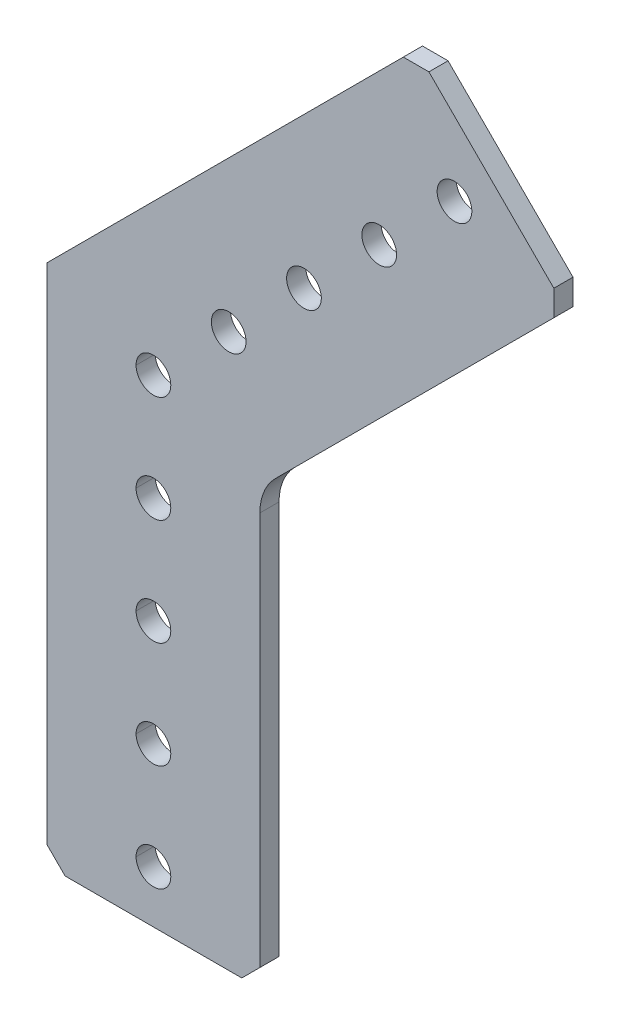
ISO-10303-21;
HEADER;
FILE_DESCRIPTION(('STEP AP214'),'2;1');
FILE_NAME('part.step','',(''),(''),'','','');
FILE_SCHEMA(('AUTOMOTIVE_DESIGN { 1 0 10303 214 1 1 1 1 }'));
ENDSEC;
DATA;
#1=APPLICATION_CONTEXT('core data for automotive mechanical design processes');
#2=APPLICATION_PROTOCOL_DEFINITION('international standard','automotive_design',2000,#1);
#3=PRODUCT_CONTEXT('',#1,'mechanical');
#4=PRODUCT('Part','Part','',(#3));
#5=PRODUCT_RELATED_PRODUCT_CATEGORY('part','',(#4));
#6=PRODUCT_DEFINITION_FORMATION('','',#4);
#7=PRODUCT_DEFINITION_CONTEXT('part definition',#1,'design');
#8=PRODUCT_DEFINITION('design','',#6,#7);
#9=PRODUCT_DEFINITION_SHAPE('','',#8);
#10=(LENGTH_UNIT() NAMED_UNIT(*) SI_UNIT(.MILLI.,.METRE.));
#11=(NAMED_UNIT(*) PLANE_ANGLE_UNIT() SI_UNIT($,.RADIAN.));
#12=(NAMED_UNIT(*) SI_UNIT($,.STERADIAN.) SOLID_ANGLE_UNIT());
#13=UNCERTAINTY_MEASURE_WITH_UNIT(LENGTH_MEASURE(1.E-05),#10,'distance_accuracy_value','');
#14=(GEOMETRIC_REPRESENTATION_CONTEXT(3) GLOBAL_UNCERTAINTY_ASSIGNED_CONTEXT((#13)) GLOBAL_UNIT_ASSIGNED_CONTEXT((#10,
#11,#12)) REPRESENTATION_CONTEXT('',''));
#15=CARTESIAN_POINT('',(0.,0.,0.));
#16=DIRECTION('',(0.,0.,1.));
#17=DIRECTION('',(1.,0.,0.));
#18=AXIS2_PLACEMENT_3D('',#15,#16,#17);
#19=CARTESIAN_POINT('',(19.05,-7.89076836320746,2.286));
#20=DIRECTION('',(0.,0.,1.));
#21=DIRECTION('',(1.,0.,0.));
#22=AXIS2_PLACEMENT_3D('',#19,#20,#21);
#23=CYLINDRICAL_SURFACE('',#22,6.35);
#24=CARTESIAN_POINT('',(19.05,-7.89076836320746,2.286));
#25=DIRECTION('',(0.,0.,-1.));
#26=DIRECTION('',(1.,0.,0.));
#27=AXIS2_PLACEMENT_3D('',#24,#25,#26);
#28=CIRCLE('',#27,6.35);
#29=CARTESIAN_POINT('',(12.7,-7.89076836320746,2.286));
#30=VERTEX_POINT('',#29);
#31=CARTESIAN_POINT('',(14.5598719394654,-3.40064030267287,2.286));
#32=VERTEX_POINT('',#31);
#33=EDGE_CURVE('E378',#30,#32,#28,.T.);
#34=ORIENTED_EDGE('',*,*,#33,.F.);
#35=DIRECTION('',(0.,0.,1.));
#36=VECTOR('',#35,1.);
#37=CARTESIAN_POINT('',(12.7,-7.89076836320746,2.286));
#38=LINE('',#37,#36);
#39=CARTESIAN_POINT('',(12.7,-7.89076836320746,0.));
#40=VERTEX_POINT('',#39);
#41=EDGE_CURVE('E441',#40,#30,#38,.T.);
#42=ORIENTED_EDGE('',*,*,#41,.F.);
#43=CARTESIAN_POINT('',(19.05,-7.89076836320746,0.));
#44=DIRECTION('',(0.,0.,1.));
#45=DIRECTION('',(1.,0.,0.));
#46=AXIS2_PLACEMENT_3D('',#43,#44,#45);
#47=CIRCLE('',#46,6.35);
#48=CARTESIAN_POINT('',(14.5598719394654,-3.40064030267287,0.));
#49=VERTEX_POINT('',#48);
#50=EDGE_CURVE('E502',#49,#40,#47,.T.);
#51=ORIENTED_EDGE('',*,*,#50,.F.);
#52=DIRECTION('',(0.,0.,-1.));
#53=VECTOR('',#52,1.);
#54=CARTESIAN_POINT('',(14.5598719394654,-3.40064030267288,0.));
#55=LINE('',#54,#53);
#56=EDGE_CURVE('E25',#32,#49,#55,.T.);
#57=ORIENTED_EDGE('',*,*,#56,.F.);
#58=EDGE_LOOP('',(#34,#42,#51,#57));
#59=FACE_BOUND('',#58,.T.);
#60=ADVANCED_FACE('F14',(#59),#23,.F.);
#61=CARTESIAN_POINT('',(-10.541,-57.023,2.286));
#62=DIRECTION('',(0.707106781186548,0.707106781186548,0.));
#63=DIRECTION('',(0.,0.,-1.));
#64=AXIS2_PLACEMENT_3D('',#61,#62,#63);
#65=PLANE('',#64);
#66=DIRECTION('',(0.707106781186548,-0.707106781186548,0.));
#67=VECTOR('',#66,1.);
#68=CARTESIAN_POINT('',(-33.782,-33.782,2.286));
#69=LINE('',#68,#67);
#70=CARTESIAN_POINT('',(-12.7,-54.864,2.286));
#71=VERTEX_POINT('',#70);
#72=CARTESIAN_POINT('',(-10.541,-57.023,2.286));
#73=VERTEX_POINT('',#72);
#74=EDGE_CURVE('E681',#71,#73,#69,.T.);
#75=ORIENTED_EDGE('',*,*,#74,.F.);
#76=DIRECTION('',(0.,0.,1.));
#77=VECTOR('',#76,1.);
#78=CARTESIAN_POINT('',(-12.7,-54.864,2.286));
#79=LINE('',#78,#77);
#80=CARTESIAN_POINT('',(-12.7,-54.864,0.));
#81=VERTEX_POINT('',#80);
#82=EDGE_CURVE('E506',#81,#71,#79,.T.);
#83=ORIENTED_EDGE('',*,*,#82,.F.);
#84=DIRECTION('',(-0.707106781186548,0.707106781186548,0.));
#85=VECTOR('',#84,1.);
#86=CARTESIAN_POINT('',(-10.541,-57.023,0.));
#87=LINE('',#86,#85);
#88=CARTESIAN_POINT('',(-10.541,-57.023,0.));
#89=VERTEX_POINT('',#88);
#90=EDGE_CURVE('E297',#89,#81,#87,.T.);
#91=ORIENTED_EDGE('',*,*,#90,.F.);
#92=DIRECTION('',(0.,0.,-1.));
#93=VECTOR('',#92,1.);
#94=CARTESIAN_POINT('',(-10.541,-57.023,2.286));
#95=LINE('',#94,#93);
#96=EDGE_CURVE('E442',#73,#89,#95,.T.);
#97=ORIENTED_EDGE('',*,*,#96,.F.);
#98=EDGE_LOOP('',(#75,#83,#91,#97));
#99=FACE_BOUND('',#98,.T.);
#100=ADVANCED_FACE('F581',(#99),#65,.F.);
#101=CARTESIAN_POINT('',(12.7,-54.864,2.286));
#102=DIRECTION('',(-0.707106781186548,0.707106781186547,0.));
#103=DIRECTION('',(0.,0.,1.));
#104=AXIS2_PLACEMENT_3D('',#101,#102,#103);
#105=PLANE('',#104);
#106=DIRECTION('',(0.707106781186547,0.707106781186548,0.));
#107=VECTOR('',#106,1.);
#108=CARTESIAN_POINT('',(33.782,-33.782,2.286));
#109=LINE('',#108,#107);
#110=CARTESIAN_POINT('',(10.541,-57.023,2.286));
#111=VERTEX_POINT('',#110);
#112=CARTESIAN_POINT('',(12.7,-54.864,2.286));
#113=VERTEX_POINT('',#112);
#114=EDGE_CURVE('E379',#111,#113,#109,.T.);
#115=ORIENTED_EDGE('',*,*,#114,.F.);
#116=DIRECTION('',(0.,0.,1.));
#117=VECTOR('',#116,1.);
#118=CARTESIAN_POINT('',(10.541,-57.023,2.286));
#119=LINE('',#118,#117);
#120=CARTESIAN_POINT('',(10.541,-57.023,0.));
#121=VERTEX_POINT('',#120);
#122=EDGE_CURVE('E438',#121,#111,#119,.T.);
#123=ORIENTED_EDGE('',*,*,#122,.F.);
#124=DIRECTION('',(-0.707106781186547,-0.707106781186548,0.));
#125=VECTOR('',#124,1.);
#126=CARTESIAN_POINT('',(12.7,-54.864,0.));
#127=LINE('',#126,#125);
#128=CARTESIAN_POINT('',(12.7,-54.864,0.));
#129=VERTEX_POINT('',#128);
#130=EDGE_CURVE('E404',#129,#121,#127,.T.);
#131=ORIENTED_EDGE('',*,*,#130,.F.);
#132=DIRECTION('',(0.,0.,-1.));
#133=VECTOR('',#132,1.);
#134=CARTESIAN_POINT('',(12.7,-54.864,2.286));
#135=LINE('',#134,#133);
#136=EDGE_CURVE('E40',#113,#129,#135,.T.);
#137=ORIENTED_EDGE('',*,*,#136,.F.);
#138=EDGE_LOOP('',(#115,#123,#131,#137));
#139=FACE_BOUND('',#138,.T.);
#140=ADVANCED_FACE('F587',(#139),#105,.F.);
#141=CARTESIAN_POINT('',(29.8144503219496,47.7749625640879,2.286));
#142=DIRECTION('',(0.,-1.,0.));
#143=DIRECTION('',(0.,0.,-1.));
#144=AXIS2_PLACEMENT_3D('',#141,#142,#143);
#145=PLANE('',#144);
#146=DIRECTION('',(-1.,0.,0.));
#147=VECTOR('',#146,1.);
#148=CARTESIAN_POINT('',(0.,47.7749625640879,2.286));
#149=LINE('',#148,#147);
#150=CARTESIAN_POINT('',(32.8677374031131,47.7749625640879,2.286));
#151=VERTEX_POINT('',#150);
#152=CARTESIAN_POINT('',(29.8144503219496,47.7749625640879,2.286));
#153=VERTEX_POINT('',#152);
#154=EDGE_CURVE('E519',#151,#153,#149,.T.);
#155=ORIENTED_EDGE('',*,*,#154,.F.);
#156=DIRECTION('',(0.,0.,1.));
#157=VECTOR('',#156,1.);
#158=CARTESIAN_POINT('',(32.8677374031131,47.7749625640879,2.286));
#159=LINE('',#158,#157);
#160=CARTESIAN_POINT('',(32.8677374031131,47.7749625640879,0.));
#161=VERTEX_POINT('',#160);
#162=EDGE_CURVE('E312',#161,#151,#159,.T.);
#163=ORIENTED_EDGE('',*,*,#162,.F.);
#164=DIRECTION('',(1.,0.,0.));
#165=VECTOR('',#164,1.);
#166=CARTESIAN_POINT('',(29.8144503219496,47.7749625640879,0.));
#167=LINE('',#166,#165);
#168=CARTESIAN_POINT('',(29.8144503219496,47.7749625640879,0.));
#169=VERTEX_POINT('',#168);
#170=EDGE_CURVE('E537',#169,#161,#167,.T.);
#171=ORIENTED_EDGE('',*,*,#170,.F.);
#172=DIRECTION('',(0.,0.,-1.));
#173=VECTOR('',#172,1.);
#174=CARTESIAN_POINT('',(29.8144503219496,47.7749625640879,2.286));
#175=LINE('',#174,#173);
#176=EDGE_CURVE('E498',#153,#169,#175,.T.);
#177=ORIENTED_EDGE('',*,*,#176,.F.);
#178=EDGE_LOOP('',(#155,#163,#171,#177));
#179=FACE_BOUND('',#178,.T.);
#180=ADVANCED_FACE('F593',(#179),#145,.F.);
#181=CARTESIAN_POINT('',(47.7749625640879,32.8677374031131,2.286));
#182=DIRECTION('',(-1.,0.,0.));
#183=DIRECTION('',(0.,0.,1.));
#184=AXIS2_PLACEMENT_3D('',#181,#182,#183);
#185=PLANE('',#184);
#186=DIRECTION('',(0.,1.,0.));
#187=VECTOR('',#186,1.);
#188=CARTESIAN_POINT('',(47.7749625640878,-1.08573281084666E-13,2.286));
#189=LINE('',#188,#187);
#190=CARTESIAN_POINT('',(47.7749625640879,29.8144503219496,2.286));
#191=VERTEX_POINT('',#190);
#192=CARTESIAN_POINT('',(47.7749625640879,32.8677374031131,2.286));
#193=VERTEX_POINT('',#192);
#194=EDGE_CURVE('E414',#191,#193,#189,.T.);
#195=ORIENTED_EDGE('',*,*,#194,.F.);
#196=DIRECTION('',(0.,0.,1.));
#197=VECTOR('',#196,1.);
#198=CARTESIAN_POINT('',(47.7749625640879,29.8144503219496,2.286));
#199=LINE('',#198,#197);
#200=CARTESIAN_POINT('',(47.7749625640879,29.8144503219496,0.));
#201=VERTEX_POINT('',#200);
#202=EDGE_CURVE('E9',#201,#191,#199,.T.);
#203=ORIENTED_EDGE('',*,*,#202,.F.);
#204=DIRECTION('',(0.,-1.,0.));
#205=VECTOR('',#204,1.);
#206=CARTESIAN_POINT('',(47.7749625640879,32.8677374031131,0.));
#207=LINE('',#206,#205);
#208=CARTESIAN_POINT('',(47.7749625640879,32.8677374031131,0.));
#209=VERTEX_POINT('',#208);
#210=EDGE_CURVE('E418',#209,#201,#207,.T.);
#211=ORIENTED_EDGE('',*,*,#210,.F.);
#212=DIRECTION('',(0.,0.,-1.));
#213=VECTOR('',#212,1.);
#214=CARTESIAN_POINT('',(47.7749625640879,32.8677374031131,2.286));
#215=LINE('',#214,#213);
#216=EDGE_CURVE('E309',#193,#209,#215,.T.);
#217=ORIENTED_EDGE('',*,*,#216,.F.);
#218=EDGE_LOOP('',(#195,#203,#211,#217));
#219=FACE_BOUND('',#218,.T.);
#220=ADVANCED_FACE('F613',(#219),#185,.F.);
#221=CARTESIAN_POINT('',(35.9210244842766,35.9210244842766,2.286));
#222=DIRECTION('',(0.,0.,-1.));
#223=DIRECTION('',(-0.707106781186548,0.707106781186548,0.));
#224=AXIS2_PLACEMENT_3D('',#221,#222,#223);
#225=CYLINDRICAL_SURFACE('',#224,2.0701);
#226=DIRECTION('',(0.,0.,-1.));
#227=VECTOR('',#226,1.);
#228=CARTESIAN_POINT('',(37.3848062320109,34.4572427365424,2.286));
#229=LINE('',#228,#227);
#230=CARTESIAN_POINT('',(37.3848062320109,34.4572427365424,2.286));
#231=VERTEX_POINT('',#230);
#232=CARTESIAN_POINT('',(37.3848062320109,34.4572427365424,0.));
#233=VERTEX_POINT('',#232);
#234=EDGE_CURVE('E346',#231,#233,#229,.T.);
#235=ORIENTED_EDGE('',*,*,#234,.F.);
#236=CARTESIAN_POINT('',(35.9210244842766,35.9210244842766,2.286));
#237=DIRECTION('',(0.,0.,-1.));
#238=DIRECTION('',(0.707106781186548,-0.707106781186548,0.));
#239=AXIS2_PLACEMENT_3D('',#236,#237,#238);
#240=CIRCLE('',#239,2.0701);
#241=CARTESIAN_POINT('',(34.4572427365424,37.3848062320109,2.286));
#242=VERTEX_POINT('',#241);
#243=EDGE_CURVE('E315',#242,#231,#240,.T.);
#244=ORIENTED_EDGE('',*,*,#243,.F.);
#245=DIRECTION('',(0.,0.,-1.));
#246=VECTOR('',#245,1.);
#247=CARTESIAN_POINT('',(34.4572427365424,37.3848062320109,2.286));
#248=LINE('',#247,#246);
#249=CARTESIAN_POINT('',(34.4572427365424,37.3848062320109,0.));
#250=VERTEX_POINT('',#249);
#251=EDGE_CURVE('E345',#242,#250,#248,.T.);
#252=ORIENTED_EDGE('',*,*,#251,.T.);
#253=CARTESIAN_POINT('',(35.9210244842766,35.9210244842766,0.));
#254=DIRECTION('',(0.,0.,-1.));
#255=DIRECTION('',(0.707106781186548,-0.707106781186548,0.));
#256=AXIS2_PLACEMENT_3D('',#253,#254,#255);
#257=CIRCLE('',#256,2.0701);
#258=EDGE_CURVE('E493',#250,#233,#257,.T.);
#259=ORIENTED_EDGE('',*,*,#258,.T.);
#260=EDGE_LOOP('',(#235,#244,#252,#259));
#261=FACE_BOUND('',#260,.T.);
#262=ADVANCED_FACE('F604',(#261),#225,.F.);
#263=CARTESIAN_POINT('',(26.9407683632078,26.9407683632072,2.286));
#264=DIRECTION('',(0.,0.,-1.));
#265=DIRECTION('',(-0.707106781186548,0.707106781186548,0.));
#266=AXIS2_PLACEMENT_3D('',#263,#264,#265);
#267=CYLINDRICAL_SURFACE('',#266,2.0701);
#268=DIRECTION('',(0.,0.,-1.));
#269=VECTOR('',#268,1.);
#270=CARTESIAN_POINT('',(28.404550110942,25.4769866154729,2.286));
#271=LINE('',#270,#269);
#272=CARTESIAN_POINT('',(28.404550110942,25.4769866154729,2.286));
#273=VERTEX_POINT('',#272);
#274=CARTESIAN_POINT('',(28.404550110942,25.4769866154729,0.));
#275=VERTEX_POINT('',#274);
#276=EDGE_CURVE('E356',#273,#275,#271,.T.);
#277=ORIENTED_EDGE('',*,*,#276,.F.);
#278=CARTESIAN_POINT('',(26.9407683632078,26.9407683632072,2.286));
#279=DIRECTION('',(0.,0.,-1.));
#280=DIRECTION('',(0.707106781186548,-0.707106781186548,0.));
#281=AXIS2_PLACEMENT_3D('',#278,#279,#280);
#282=CIRCLE('',#281,2.0701);
#283=CARTESIAN_POINT('',(25.4769866154735,28.4045501109414,2.286));
#284=VERTEX_POINT('',#283);
#285=EDGE_CURVE('E270',#284,#273,#282,.T.);
#286=ORIENTED_EDGE('',*,*,#285,.F.);
#287=DIRECTION('',(0.,0.,-1.));
#288=VECTOR('',#287,1.);
#289=CARTESIAN_POINT('',(25.4769866154735,28.4045501109414,2.286));
#290=LINE('',#289,#288);
#291=CARTESIAN_POINT('',(25.4769866154735,28.4045501109414,0.));
#292=VERTEX_POINT('',#291);
#293=EDGE_CURVE('E397',#284,#292,#290,.T.);
#294=ORIENTED_EDGE('',*,*,#293,.T.);
#295=CARTESIAN_POINT('',(26.9407683632078,26.9407683632072,0.));
#296=DIRECTION('',(0.,0.,-1.));
#297=DIRECTION('',(0.707106781186548,-0.707106781186548,0.));
#298=AXIS2_PLACEMENT_3D('',#295,#296,#297);
#299=CIRCLE('',#298,2.0701);
#300=EDGE_CURVE('E367',#292,#275,#299,.T.);
#301=ORIENTED_EDGE('',*,*,#300,.T.);
#302=EDGE_LOOP('',(#277,#286,#294,#301));
#303=FACE_BOUND('',#302,.T.);
#304=ADVANCED_FACE('F560',(#303),#267,.F.);
#305=CARTESIAN_POINT('',(17.9605122421385,17.9605122421382,2.286));
#306=DIRECTION('',(0.,0.,-1.));
#307=DIRECTION('',(-0.707106781186548,0.707106781186548,0.));
#308=AXIS2_PLACEMENT_3D('',#305,#306,#307);
#309=CYLINDRICAL_SURFACE('',#308,2.0701);
#310=DIRECTION('',(0.,0.,-1.));
#311=VECTOR('',#310,1.);
#312=CARTESIAN_POINT('',(19.4242939898727,16.4967304944038,2.286));
#313=LINE('',#312,#311);
#314=CARTESIAN_POINT('',(19.4242939898727,16.4967304944038,2.286));
#315=VERTEX_POINT('',#314);
#316=CARTESIAN_POINT('',(19.4242939898727,16.4967304944038,0.));
#317=VERTEX_POINT('',#316);
#318=EDGE_CURVE('E304',#315,#317,#313,.T.);
#319=ORIENTED_EDGE('',*,*,#318,.F.);
#320=CARTESIAN_POINT('',(17.9605122421385,17.9605122421382,2.286));
#321=DIRECTION('',(0.,0.,-1.));
#322=DIRECTION('',(0.707106781186548,-0.707106781186548,0.));
#323=AXIS2_PLACEMENT_3D('',#320,#321,#322);
#324=CIRCLE('',#323,2.0701);
#325=CARTESIAN_POINT('',(16.4967304944042,19.4242939898724,2.286));
#326=VERTEX_POINT('',#325);
#327=EDGE_CURVE('E269',#326,#315,#324,.T.);
#328=ORIENTED_EDGE('',*,*,#327,.F.);
#329=DIRECTION('',(0.,0.,-1.));
#330=VECTOR('',#329,1.);
#331=CARTESIAN_POINT('',(16.4967304944042,19.4242939898724,2.286));
#332=LINE('',#331,#330);
#333=CARTESIAN_POINT('',(16.4967304944042,19.4242939898724,0.));
#334=VERTEX_POINT('',#333);
#335=EDGE_CURVE('E286',#326,#334,#332,.T.);
#336=ORIENTED_EDGE('',*,*,#335,.T.);
#337=CARTESIAN_POINT('',(17.9605122421385,17.9605122421382,0.));
#338=DIRECTION('',(0.,0.,-1.));
#339=DIRECTION('',(0.707106781186548,-0.707106781186548,0.));
#340=AXIS2_PLACEMENT_3D('',#337,#338,#339);
#341=CIRCLE('',#340,2.0701);
#342=EDGE_CURVE('E417',#334,#317,#341,.T.);
#343=ORIENTED_EDGE('',*,*,#342,.T.);
#344=EDGE_LOOP('',(#319,#328,#336,#343));
#345=FACE_BOUND('',#344,.T.);
#346=ADVANCED_FACE('F603',(#345),#309,.F.);
#347=CARTESIAN_POINT('',(8.98025612106924,8.98025612106906,2.286));
#348=DIRECTION('',(0.,0.,-1.));
#349=DIRECTION('',(-0.707106781186547,0.707106781186548,0.));
#350=AXIS2_PLACEMENT_3D('',#347,#348,#349);
#351=CYLINDRICAL_SURFACE('',#350,2.0701);
#352=DIRECTION('',(0.,0.,-1.));
#353=VECTOR('',#352,1.);
#354=CARTESIAN_POINT('',(10.4440378688035,7.51647437333479,2.286));
#355=LINE('',#354,#353);
#356=CARTESIAN_POINT('',(10.4440378688035,7.51647437333479,2.286));
#357=VERTEX_POINT('',#356);
#358=CARTESIAN_POINT('',(10.4440378688035,7.51647437333479,0.));
#359=VERTEX_POINT('',#358);
#360=EDGE_CURVE('E274',#357,#359,#355,.T.);
#361=ORIENTED_EDGE('',*,*,#360,.F.);
#362=CARTESIAN_POINT('',(8.98025612106924,8.98025612106906,2.286));
#363=DIRECTION('',(0.,0.,-1.));
#364=DIRECTION('',(0.707106781186548,-0.707106781186547,0.));
#365=AXIS2_PLACEMENT_3D('',#362,#363,#364);
#366=CIRCLE('',#365,2.0701);
#367=CARTESIAN_POINT('',(7.51647437333497,10.4440378688033,2.286));
#368=VERTEX_POINT('',#367);
#369=EDGE_CURVE('E259',#368,#357,#366,.T.);
#370=ORIENTED_EDGE('',*,*,#369,.F.);
#371=DIRECTION('',(0.,0.,-1.));
#372=VECTOR('',#371,1.);
#373=CARTESIAN_POINT('',(7.51647437333497,10.4440378688033,2.286));
#374=LINE('',#373,#372);
#375=CARTESIAN_POINT('',(7.51647437333497,10.4440378688033,0.));
#376=VERTEX_POINT('',#375);
#377=EDGE_CURVE('E284',#368,#376,#374,.T.);
#378=ORIENTED_EDGE('',*,*,#377,.T.);
#379=CARTESIAN_POINT('',(8.98025612106924,8.98025612106906,0.));
#380=DIRECTION('',(0.,0.,-1.));
#381=DIRECTION('',(0.707106781186548,-0.707106781186547,0.));
#382=AXIS2_PLACEMENT_3D('',#379,#380,#381);
#383=CIRCLE('',#382,2.0701);
#384=EDGE_CURVE('E276',#376,#359,#383,.T.);
#385=ORIENTED_EDGE('',*,*,#384,.T.);
#386=EDGE_LOOP('',(#361,#370,#378,#385));
#387=FACE_BOUND('',#386,.T.);
#388=ADVANCED_FACE('F275',(#387),#351,.F.);
#389=CARTESIAN_POINT('',(12.7,-5.26051224213831,2.286));
#390=DIRECTION('',(-0.707106781186548,0.707106781186547,0.));
#391=DIRECTION('',(0.,0.,1.));
#392=AXIS2_PLACEMENT_3D('',#389,#390,#391);
#393=PLANE('',#392);
#394=DIRECTION('',(-0.707106781186548,-0.707106781186548,0.));
#395=VECTOR('',#394,1.);
#396=CARTESIAN_POINT('',(12.7,-5.26051224213831,2.286));
#397=LINE('',#396,#395);
#398=EDGE_CURVE('E410',#191,#32,#397,.T.);
#399=ORIENTED_EDGE('',*,*,#398,.T.);
#400=ORIENTED_EDGE('',*,*,#56,.T.);
#401=DIRECTION('',(-0.707106781186548,-0.707106781186548,0.));
#402=VECTOR('',#401,1.);
#403=CARTESIAN_POINT('',(12.7,-5.26051224213831,0.));
#404=LINE('',#403,#402);
#405=EDGE_CURVE('E422',#201,#49,#404,.T.);
#406=ORIENTED_EDGE('',*,*,#405,.F.);
#407=ORIENTED_EDGE('',*,*,#202,.T.);
#408=EDGE_LOOP('',(#399,#400,#406,#407));
#409=FACE_BOUND('',#408,.T.);
#410=ADVANCED_FACE('F630',(#409),#393,.F.);
#411=CARTESIAN_POINT('',(49.3016061046697,31.3410938625313,2.286));
#412=DIRECTION('',(-0.707106781186547,-0.707106781186548,0.));
#413=DIRECTION('',(-0.707106781186548,0.707106781186547,0.));
#414=AXIS2_PLACEMENT_3D('',#411,#412,#413);
#415=PLANE('',#414);
#416=DIRECTION('',(0.707106781186548,-0.707106781186548,0.));
#417=VECTOR('',#416,1.);
#418=CARTESIAN_POINT('',(49.3016061046697,31.3410938625313,0.));
#419=LINE('',#418,#417);
#420=EDGE_CURVE('E423',#161,#209,#419,.T.);
#421=ORIENTED_EDGE('',*,*,#420,.F.);
#422=ORIENTED_EDGE('',*,*,#162,.T.);
#423=DIRECTION('',(0.707106781186548,-0.707106781186548,0.));
#424=VECTOR('',#423,1.);
#425=CARTESIAN_POINT('',(49.3016061046697,31.3410938625313,2.286));
#426=LINE('',#425,#424);
#427=EDGE_CURVE('E545',#151,#193,#426,.T.);
#428=ORIENTED_EDGE('',*,*,#427,.T.);
#429=ORIENTED_EDGE('',*,*,#216,.T.);
#430=EDGE_LOOP('',(#421,#422,#428,#429));
#431=FACE_BOUND('',#430,.T.);
#432=ADVANCED_FACE('F16',(#431),#415,.F.);
#433=CARTESIAN_POINT('',(31.3410938625313,49.3016061046697,2.286));
#434=DIRECTION('',(0.707106781186548,-0.707106781186548,0.));
#435=DIRECTION('',(0.,0.,-1.));
#436=AXIS2_PLACEMENT_3D('',#433,#434,#435);
#437=PLANE('',#436);
#438=DIRECTION('',(0.707106781186548,0.707106781186548,0.));
#439=VECTOR('',#438,1.);
#440=CARTESIAN_POINT('',(31.3410938625313,49.3016061046697,2.286));
#441=LINE('',#440,#439);
#442=CARTESIAN_POINT('',(-12.7,5.26051224213831,2.286));
#443=VERTEX_POINT('',#442);
#444=EDGE_CURVE('E460',#443,#153,#441,.T.);
#445=ORIENTED_EDGE('',*,*,#444,.T.);
#446=ORIENTED_EDGE('',*,*,#176,.T.);
#447=DIRECTION('',(0.707106781186548,0.707106781186548,0.));
#448=VECTOR('',#447,1.);
#449=CARTESIAN_POINT('',(31.3410938625313,49.3016061046697,0.));
#450=LINE('',#449,#448);
#451=CARTESIAN_POINT('',(-12.7,5.26051224213831,0.));
#452=VERTEX_POINT('',#451);
#453=EDGE_CURVE('E432',#452,#169,#450,.T.);
#454=ORIENTED_EDGE('',*,*,#453,.F.);
#455=DIRECTION('',(0.,0.,-1.));
#456=VECTOR('',#455,1.);
#457=CARTESIAN_POINT('',(-12.7,5.26051224213831,2.286));
#458=LINE('',#457,#456);
#459=EDGE_CURVE('E509',#443,#452,#458,.T.);
#460=ORIENTED_EDGE('',*,*,#459,.F.);
#461=EDGE_LOOP('',(#445,#446,#454,#460));
#462=FACE_BOUND('',#461,.T.);
#463=ADVANCED_FACE('F739',(#462),#437,.F.);
#464=CARTESIAN_POINT('',(0.,-50.8,2.286));
#465=DIRECTION('',(0.,0.,-1.));
#466=DIRECTION('',(-1.,0.,0.));
#467=AXIS2_PLACEMENT_3D('',#464,#465,#466);
#468=CYLINDRICAL_SURFACE('',#467,2.0701);
#469=DIRECTION('',(0.,0.,-1.));
#470=VECTOR('',#469,1.);
#471=CARTESIAN_POINT('',(2.0701,-50.8,2.286));
#472=LINE('',#471,#470);
#473=CARTESIAN_POINT('',(2.0701,-50.8,2.286));
#474=VERTEX_POINT('',#473);
#475=CARTESIAN_POINT('',(2.0701,-50.8,0.));
#476=VERTEX_POINT('',#475);
#477=EDGE_CURVE('E369',#474,#476,#472,.T.);
#478=ORIENTED_EDGE('',*,*,#477,.F.);
#479=CARTESIAN_POINT('',(0.,-50.8,2.286));
#480=DIRECTION('',(0.,0.,1.));
#481=DIRECTION('',(1.,0.,0.));
#482=AXIS2_PLACEMENT_3D('',#479,#480,#481);
#483=CIRCLE('',#482,2.0701);
#484=CARTESIAN_POINT('',(-2.0701,-50.8,2.286));
#485=VERTEX_POINT('',#484);
#486=EDGE_CURVE('E437',#474,#485,#483,.T.);
#487=ORIENTED_EDGE('',*,*,#486,.T.);
#488=DIRECTION('',(0.,0.,-1.));
#489=VECTOR('',#488,1.);
#490=CARTESIAN_POINT('',(-2.0701,-50.8,2.286));
#491=LINE('',#490,#489);
#492=CARTESIAN_POINT('',(-2.0701,-50.8,0.));
#493=VERTEX_POINT('',#492);
#494=EDGE_CURVE('E702',#485,#493,#491,.T.);
#495=ORIENTED_EDGE('',*,*,#494,.T.);
#496=CARTESIAN_POINT('',(0.,-50.8,0.));
#497=DIRECTION('',(0.,0.,1.));
#498=DIRECTION('',(1.,0.,0.));
#499=AXIS2_PLACEMENT_3D('',#496,#497,#498);
#500=CIRCLE('',#499,2.0701);
#501=EDGE_CURVE('E468',#476,#493,#500,.T.);
#502=ORIENTED_EDGE('',*,*,#501,.F.);
#503=EDGE_LOOP('',(#478,#487,#495,#502));
#504=FACE_BOUND('',#503,.T.);
#505=ADVANCED_FACE('F657',(#504),#468,.F.);
#506=CARTESIAN_POINT('',(3.9907631702977E-13,-38.1,2.286));
#507=DIRECTION('',(0.,0.,-1.));
#508=DIRECTION('',(-1.,0.,0.));
#509=AXIS2_PLACEMENT_3D('',#506,#507,#508);
#510=CYLINDRICAL_SURFACE('',#509,2.0701);
#511=DIRECTION('',(0.,0.,-1.));
#512=VECTOR('',#511,1.);
#513=CARTESIAN_POINT('',(2.0701000000004,-38.1,2.286));
#514=LINE('',#513,#512);
#515=CARTESIAN_POINT('',(2.0701000000004,-38.1,2.286));
#516=VERTEX_POINT('',#515);
#517=CARTESIAN_POINT('',(2.0701000000004,-38.1,0.));
#518=VERTEX_POINT('',#517);
#519=EDGE_CURVE('E403',#516,#518,#514,.T.);
#520=ORIENTED_EDGE('',*,*,#519,.F.);
#521=CARTESIAN_POINT('',(3.9907631702977E-13,-38.1,2.286));
#522=DIRECTION('',(0.,0.,1.));
#523=DIRECTION('',(1.,0.,0.));
#524=AXIS2_PLACEMENT_3D('',#521,#522,#523);
#525=CIRCLE('',#524,2.0701);
#526=CARTESIAN_POINT('',(-2.0700999999996,-38.1,2.286));
#527=VERTEX_POINT('',#526);
#528=EDGE_CURVE('E299',#516,#527,#525,.T.);
#529=ORIENTED_EDGE('',*,*,#528,.T.);
#530=DIRECTION('',(0.,0.,-1.));
#531=VECTOR('',#530,1.);
#532=CARTESIAN_POINT('',(-2.0700999999996,-38.1,2.286));
#533=LINE('',#532,#531);
#534=CARTESIAN_POINT('',(-2.0700999999996,-38.1,0.));
#535=VERTEX_POINT('',#534);
#536=EDGE_CURVE('E402',#527,#535,#533,.T.);
#537=ORIENTED_EDGE('',*,*,#536,.T.);
#538=CARTESIAN_POINT('',(3.9907631702977E-13,-38.1,0.));
#539=DIRECTION('',(0.,0.,1.));
#540=DIRECTION('',(1.,0.,0.));
#541=AXIS2_PLACEMENT_3D('',#538,#539,#540);
#542=CIRCLE('',#541,2.0701);
#543=EDGE_CURVE('E465',#518,#535,#542,.T.);
#544=ORIENTED_EDGE('',*,*,#543,.F.);
#545=EDGE_LOOP('',(#520,#529,#537,#544));
#546=FACE_BOUND('',#545,.T.);
#547=ADVANCED_FACE('F652',(#546),#510,.F.);
#548=CARTESIAN_POINT('',(2.66050878019847E-13,-25.4,2.286));
#549=DIRECTION('',(0.,0.,-1.));
#550=DIRECTION('',(-1.,0.,0.));
#551=AXIS2_PLACEMENT_3D('',#548,#549,#550);
#552=CYLINDRICAL_SURFACE('',#551,2.0701);
#553=DIRECTION('',(0.,0.,-1.));
#554=VECTOR('',#553,1.);
#555=CARTESIAN_POINT('',(2.07010000000027,-25.4,2.286));
#556=LINE('',#555,#554);
#557=CARTESIAN_POINT('',(2.07010000000027,-25.4,2.286));
#558=VERTEX_POINT('',#557);
#559=CARTESIAN_POINT('',(2.07010000000027,-25.4,0.));
#560=VERTEX_POINT('',#559);
#561=EDGE_CURVE('E482',#558,#560,#556,.T.);
#562=ORIENTED_EDGE('',*,*,#561,.F.);
#563=CARTESIAN_POINT('',(2.66050878019847E-13,-25.4,2.286));
#564=DIRECTION('',(0.,0.,1.));
#565=DIRECTION('',(1.,0.,0.));
#566=AXIS2_PLACEMENT_3D('',#563,#564,#565);
#567=CIRCLE('',#566,2.0701);
#568=CARTESIAN_POINT('',(-2.07009999999973,-25.4,2.286));
#569=VERTEX_POINT('',#568);
#570=EDGE_CURVE('E488',#558,#569,#567,.T.);
#571=ORIENTED_EDGE('',*,*,#570,.T.);
#572=DIRECTION('',(0.,0.,-1.));
#573=VECTOR('',#572,1.);
#574=CARTESIAN_POINT('',(-2.07009999999973,-25.4,2.286));
#575=LINE('',#574,#573);
#576=CARTESIAN_POINT('',(-2.07009999999973,-25.4,0.));
#577=VERTEX_POINT('',#576);
#578=EDGE_CURVE('E391',#569,#577,#575,.T.);
#579=ORIENTED_EDGE('',*,*,#578,.T.);
#580=CARTESIAN_POINT('',(2.66050878019847E-13,-25.4,0.));
#581=DIRECTION('',(0.,0.,1.));
#582=DIRECTION('',(1.,0.,0.));
#583=AXIS2_PLACEMENT_3D('',#580,#581,#582);
#584=CIRCLE('',#583,2.0701);
#585=EDGE_CURVE('E464',#560,#577,#584,.T.);
#586=ORIENTED_EDGE('',*,*,#585,.F.);
#587=EDGE_LOOP('',(#562,#571,#579,#586));
#588=FACE_BOUND('',#587,.T.);
#589=ADVANCED_FACE('F628',(#588),#552,.F.);
#590=CARTESIAN_POINT('',(1.33025439009923E-13,-12.7,2.286));
#591=DIRECTION('',(0.,0.,-1.));
#592=DIRECTION('',(-1.,0.,0.));
#593=AXIS2_PLACEMENT_3D('',#590,#591,#592);
#594=CYLINDRICAL_SURFACE('',#593,2.0701);
#595=DIRECTION('',(0.,0.,-1.));
#596=VECTOR('',#595,1.);
#597=CARTESIAN_POINT('',(2.07010000000014,-12.7,2.286));
#598=LINE('',#597,#596);
#599=CARTESIAN_POINT('',(2.07010000000014,-12.7,2.286));
#600=VERTEX_POINT('',#599);
#601=CARTESIAN_POINT('',(2.07010000000014,-12.7,0.));
#602=VERTEX_POINT('',#601);
#603=EDGE_CURVE('E390',#600,#602,#598,.T.);
#604=ORIENTED_EDGE('',*,*,#603,.F.);
#605=CARTESIAN_POINT('',(1.33025439009923E-13,-12.7,2.286));
#606=DIRECTION('',(0.,0.,1.));
#607=DIRECTION('',(1.,0.,0.));
#608=AXIS2_PLACEMENT_3D('',#605,#606,#607);
#609=CIRCLE('',#608,2.0701);
#610=CARTESIAN_POINT('',(-2.07009999999987,-12.7,2.286));
#611=VERTEX_POINT('',#610);
#612=EDGE_CURVE('E301',#600,#611,#609,.T.);
#613=ORIENTED_EDGE('',*,*,#612,.T.);
#614=DIRECTION('',(0.,0.,-1.));
#615=VECTOR('',#614,1.);
#616=CARTESIAN_POINT('',(-2.07009999999987,-12.7,2.286));
#617=LINE('',#616,#615);
#618=CARTESIAN_POINT('',(-2.07009999999987,-12.7,0.));
#619=VERTEX_POINT('',#618);
#620=EDGE_CURVE('E427',#611,#619,#617,.T.);
#621=ORIENTED_EDGE('',*,*,#620,.T.);
#622=CARTESIAN_POINT('',(1.33025439009923E-13,-12.7,0.));
#623=DIRECTION('',(0.,0.,1.));
#624=DIRECTION('',(1.,0.,0.));
#625=AXIS2_PLACEMENT_3D('',#622,#623,#624);
#626=CIRCLE('',#625,2.0701);
#627=EDGE_CURVE('E461',#602,#619,#626,.T.);
#628=ORIENTED_EDGE('',*,*,#627,.F.);
#629=EDGE_LOOP('',(#604,#613,#621,#628));
#630=FACE_BOUND('',#629,.T.);
#631=ADVANCED_FACE('F624',(#630),#594,.F.);
#632=CARTESIAN_POINT('',(0.,0.,2.286));
#633=DIRECTION('',(0.,0.,-1.));
#634=DIRECTION('',(-1.,0.,0.));
#635=AXIS2_PLACEMENT_3D('',#632,#633,#634);
#636=CYLINDRICAL_SURFACE('',#635,2.0701);
#637=DIRECTION('',(0.,0.,-1.));
#638=VECTOR('',#637,1.);
#639=CARTESIAN_POINT('',(2.0701,0.,2.286));
#640=LINE('',#639,#638);
#641=CARTESIAN_POINT('',(2.0701,0.,2.286));
#642=VERTEX_POINT('',#641);
#643=CARTESIAN_POINT('',(2.0701,0.,0.));
#644=VERTEX_POINT('',#643);
#645=EDGE_CURVE('E320',#642,#644,#640,.T.);
#646=ORIENTED_EDGE('',*,*,#645,.F.);
#647=CARTESIAN_POINT('',(0.,0.,2.286));
#648=DIRECTION('',(0.,0.,-1.));
#649=DIRECTION('',(1.,0.,0.));
#650=AXIS2_PLACEMENT_3D('',#647,#648,#649);
#651=CIRCLE('',#650,2.0701);
#652=CARTESIAN_POINT('',(-2.0701,0.,2.286));
#653=VERTEX_POINT('',#652);
#654=EDGE_CURVE('E302',#653,#642,#651,.T.);
#655=ORIENTED_EDGE('',*,*,#654,.F.);
#656=DIRECTION('',(0.,0.,-1.));
#657=VECTOR('',#656,1.);
#658=CARTESIAN_POINT('',(-2.0701,0.,2.286));
#659=LINE('',#658,#657);
#660=CARTESIAN_POINT('',(-2.0701,0.,0.));
#661=VERTEX_POINT('',#660);
#662=EDGE_CURVE('E319',#653,#661,#659,.T.);
#663=ORIENTED_EDGE('',*,*,#662,.T.);
#664=CARTESIAN_POINT('',(0.,0.,0.));
#665=DIRECTION('',(0.,0.,-1.));
#666=DIRECTION('',(1.,0.,0.));
#667=AXIS2_PLACEMENT_3D('',#664,#665,#666);
#668=CIRCLE('',#667,2.0701);
#669=EDGE_CURVE('E408',#661,#644,#668,.T.);
#670=ORIENTED_EDGE('',*,*,#669,.T.);
#671=EDGE_LOOP('',(#646,#655,#663,#670));
#672=FACE_BOUND('',#671,.T.);
#673=ADVANCED_FACE('F627',(#672),#636,.F.);
#674=CARTESIAN_POINT('',(12.7,-5.2605122421383,2.286));
#675=DIRECTION('',(-1.,0.,0.));
#676=DIRECTION('',(0.,1.,0.));
#677=AXIS2_PLACEMENT_3D('',#674,#675,#676);
#678=PLANE('',#677);
#679=DIRECTION('',(0.,1.,0.));
#680=VECTOR('',#679,1.);
#681=CARTESIAN_POINT('',(12.7,-5.2605122421383,0.));
#682=LINE('',#681,#680);
#683=EDGE_CURVE('E409',#129,#40,#682,.T.);
#684=ORIENTED_EDGE('',*,*,#683,.T.);
#685=ORIENTED_EDGE('',*,*,#41,.T.);
#686=DIRECTION('',(0.,1.,0.));
#687=VECTOR('',#686,1.);
#688=CARTESIAN_POINT('',(12.7,-5.2605122421383,2.286));
#689=LINE('',#688,#687);
#690=EDGE_CURVE('E374',#113,#30,#689,.T.);
#691=ORIENTED_EDGE('',*,*,#690,.F.);
#692=ORIENTED_EDGE('',*,*,#136,.T.);
#693=EDGE_LOOP('',(#684,#685,#691,#692));
#694=FACE_BOUND('',#693,.T.);
#695=ADVANCED_FACE('F637',(#694),#678,.F.);
#696=CARTESIAN_POINT('',(12.7,-57.023,2.286));
#697=DIRECTION('',(0.,1.,0.));
#698=DIRECTION('',(1.,0.,0.));
#699=AXIS2_PLACEMENT_3D('',#696,#697,#698);
#700=PLANE('',#699);
#701=DIRECTION('',(1.,0.,0.));
#702=VECTOR('',#701,1.);
#703=CARTESIAN_POINT('',(12.7,-57.023,2.286));
#704=LINE('',#703,#702);
#705=EDGE_CURVE('E18',#73,#111,#704,.T.);
#706=ORIENTED_EDGE('',*,*,#705,.F.);
#707=ORIENTED_EDGE('',*,*,#96,.T.);
#708=DIRECTION('',(1.,0.,0.));
#709=VECTOR('',#708,1.);
#710=CARTESIAN_POINT('',(12.7,-57.023,0.));
#711=LINE('',#710,#709);
#712=EDGE_CURVE('E322',#89,#121,#711,.T.);
#713=ORIENTED_EDGE('',*,*,#712,.T.);
#714=ORIENTED_EDGE('',*,*,#122,.T.);
#715=EDGE_LOOP('',(#706,#707,#713,#714));
#716=FACE_BOUND('',#715,.T.);
#717=ADVANCED_FACE('F640',(#716),#700,.F.);
#718=CARTESIAN_POINT('',(-12.7,-57.023,2.286));
#719=DIRECTION('',(1.,0.,0.));
#720=DIRECTION('',(0.,1.,0.));
#721=AXIS2_PLACEMENT_3D('',#718,#719,#720);
#722=PLANE('',#721);
#723=DIRECTION('',(0.,-1.,0.));
#724=VECTOR('',#723,1.);
#725=CARTESIAN_POINT('',(-12.7,-57.023,0.));
#726=LINE('',#725,#724);
#727=EDGE_CURVE('E337',#452,#81,#726,.T.);
#728=ORIENTED_EDGE('',*,*,#727,.T.);
#729=ORIENTED_EDGE('',*,*,#82,.T.);
#730=DIRECTION('',(0.,-1.,0.));
#731=VECTOR('',#730,1.);
#732=CARTESIAN_POINT('',(-12.7,-57.023,2.286));
#733=LINE('',#732,#731);
#734=EDGE_CURVE('E678',#443,#71,#733,.T.);
#735=ORIENTED_EDGE('',*,*,#734,.F.);
#736=ORIENTED_EDGE('',*,*,#459,.T.);
#737=EDGE_LOOP('',(#728,#729,#735,#736));
#738=FACE_BOUND('',#737,.T.);
#739=ADVANCED_FACE('F740',(#738),#722,.F.);
#740=CARTESIAN_POINT('',(0.,0.,0.));
#741=DIRECTION('',(0.,0.,1.));
#742=DIRECTION('',(1.,0.,0.));
#743=AXIS2_PLACEMENT_3D('',#740,#741,#742);
#744=PLANE('',#743);
#745=ORIENTED_EDGE('',*,*,#258,.F.);
#746=CARTESIAN_POINT('',(35.9210244842766,35.9210244842766,0.));
#747=DIRECTION('',(0.,0.,-1.));
#748=DIRECTION('',(0.707106781186548,-0.707106781186548,0.));
#749=AXIS2_PLACEMENT_3D('',#746,#747,#748);
#750=CIRCLE('',#749,2.0701);
#751=EDGE_CURVE('E342',#233,#250,#750,.T.);
#752=ORIENTED_EDGE('',*,*,#751,.F.);
#753=EDGE_LOOP('',(#745,#752));
#754=FACE_BOUND('',#753,.T.);
#755=ORIENTED_EDGE('',*,*,#342,.F.);
#756=CARTESIAN_POINT('',(17.9605122421385,17.9605122421382,0.));
#757=DIRECTION('',(0.,0.,-1.));
#758=DIRECTION('',(0.707106781186548,-0.707106781186548,0.));
#759=AXIS2_PLACEMENT_3D('',#756,#757,#758);
#760=CIRCLE('',#759,2.0701);
#761=EDGE_CURVE('E293',#317,#334,#760,.T.);
#762=ORIENTED_EDGE('',*,*,#761,.F.);
#763=EDGE_LOOP('',(#755,#762));
#764=FACE_BOUND('',#763,.T.);
#765=ORIENTED_EDGE('',*,*,#384,.F.);
#766=CARTESIAN_POINT('',(8.98025612106924,8.98025612106906,0.));
#767=DIRECTION('',(0.,0.,-1.));
#768=DIRECTION('',(0.707106781186548,-0.707106781186547,0.));
#769=AXIS2_PLACEMENT_3D('',#766,#767,#768);
#770=CIRCLE('',#769,2.0701);
#771=EDGE_CURVE('E281',#359,#376,#770,.T.);
#772=ORIENTED_EDGE('',*,*,#771,.F.);
#773=EDGE_LOOP('',(#765,#772));
#774=FACE_BOUND('',#773,.T.);
#775=ORIENTED_EDGE('',*,*,#300,.F.);
#776=CARTESIAN_POINT('',(26.9407683632078,26.9407683632072,0.));
#777=DIRECTION('',(0.,0.,-1.));
#778=DIRECTION('',(0.707106781186548,-0.707106781186548,0.));
#779=AXIS2_PLACEMENT_3D('',#776,#777,#778);
#780=CIRCLE('',#779,2.0701);
#781=EDGE_CURVE('E363',#275,#292,#780,.T.);
#782=ORIENTED_EDGE('',*,*,#781,.F.);
#783=EDGE_LOOP('',(#775,#782));
#784=FACE_BOUND('',#783,.T.);
#785=CARTESIAN_POINT('',(0.,-50.8,0.));
#786=DIRECTION('',(0.,0.,1.));
#787=DIRECTION('',(1.,0.,0.));
#788=AXIS2_PLACEMENT_3D('',#785,#786,#787);
#789=CIRCLE('',#788,2.0701);
#790=EDGE_CURVE('E340',#493,#476,#789,.T.);
#791=ORIENTED_EDGE('',*,*,#790,.T.);
#792=ORIENTED_EDGE('',*,*,#501,.T.);
#793=EDGE_LOOP('',(#791,#792));
#794=FACE_BOUND('',#793,.T.);
#795=CARTESIAN_POINT('',(2.66050878019847E-13,-25.4,0.));
#796=DIRECTION('',(0.,0.,1.));
#797=DIRECTION('',(1.,0.,0.));
#798=AXIS2_PLACEMENT_3D('',#795,#796,#797);
#799=CIRCLE('',#798,2.0701);
#800=EDGE_CURVE('E497',#577,#560,#799,.T.);
#801=ORIENTED_EDGE('',*,*,#800,.T.);
#802=ORIENTED_EDGE('',*,*,#585,.T.);
#803=EDGE_LOOP('',(#801,#802));
#804=FACE_BOUND('',#803,.T.);
#805=CARTESIAN_POINT('',(1.33025439009923E-13,-12.7,0.));
#806=DIRECTION('',(0.,0.,1.));
#807=DIRECTION('',(1.,0.,0.));
#808=AXIS2_PLACEMENT_3D('',#805,#806,#807);
#809=CIRCLE('',#808,2.0701);
#810=EDGE_CURVE('E424',#619,#602,#809,.T.);
#811=ORIENTED_EDGE('',*,*,#810,.T.);
#812=ORIENTED_EDGE('',*,*,#627,.T.);
#813=EDGE_LOOP('',(#811,#812));
#814=FACE_BOUND('',#813,.T.);
#815=CARTESIAN_POINT('',(3.9907631702977E-13,-38.1,0.));
#816=DIRECTION('',(0.,0.,1.));
#817=DIRECTION('',(1.,0.,0.));
#818=AXIS2_PLACEMENT_3D('',#815,#816,#817);
#819=CIRCLE('',#818,2.0701);
#820=EDGE_CURVE('E398',#535,#518,#819,.T.);
#821=ORIENTED_EDGE('',*,*,#820,.T.);
#822=ORIENTED_EDGE('',*,*,#543,.T.);
#823=EDGE_LOOP('',(#821,#822));
#824=FACE_BOUND('',#823,.T.);
#825=ORIENTED_EDGE('',*,*,#669,.F.);
#826=CARTESIAN_POINT('',(0.,0.,0.));
#827=DIRECTION('',(0.,0.,-1.));
#828=DIRECTION('',(1.,0.,0.));
#829=AXIS2_PLACEMENT_3D('',#826,#827,#828);
#830=CIRCLE('',#829,2.0701);
#831=EDGE_CURVE('E316',#644,#661,#830,.T.);
#832=ORIENTED_EDGE('',*,*,#831,.F.);
#833=EDGE_LOOP('',(#825,#832));
#834=FACE_BOUND('',#833,.T.);
#835=ORIENTED_EDGE('',*,*,#712,.F.);
#836=ORIENTED_EDGE('',*,*,#90,.T.);
#837=ORIENTED_EDGE('',*,*,#727,.F.);
#838=ORIENTED_EDGE('',*,*,#453,.T.);
#839=ORIENTED_EDGE('',*,*,#170,.T.);
#840=ORIENTED_EDGE('',*,*,#420,.T.);
#841=ORIENTED_EDGE('',*,*,#210,.T.);
#842=ORIENTED_EDGE('',*,*,#405,.T.);
#843=ORIENTED_EDGE('',*,*,#50,.T.);
#844=ORIENTED_EDGE('',*,*,#683,.F.);
#845=ORIENTED_EDGE('',*,*,#130,.T.);
#846=EDGE_LOOP('',(#835,#836,#837,#838,#839,#840,#841,#842,#843,#844,#845));
#847=FACE_BOUND('',#846,.T.);
#848=ADVANCED_FACE('F563',(#754,#764,#774,#784,#794,#804,#814,#824,#834,#847),#744,.F.);
#849=CARTESIAN_POINT('',(0.,0.,2.286));
#850=DIRECTION('',(0.,0.,1.));
#851=DIRECTION('',(1.,0.,0.));
#852=AXIS2_PLACEMENT_3D('',#849,#850,#851);
#853=PLANE('',#852);
#854=ORIENTED_EDGE('',*,*,#243,.T.);
#855=CARTESIAN_POINT('',(35.9210244842766,35.9210244842766,2.286));
#856=DIRECTION('',(0.,0.,-1.));
#857=DIRECTION('',(0.707106781186548,-0.707106781186548,0.));
#858=AXIS2_PLACEMENT_3D('',#855,#856,#857);
#859=CIRCLE('',#858,2.0701);
#860=EDGE_CURVE('E385',#231,#242,#859,.T.);
#861=ORIENTED_EDGE('',*,*,#860,.T.);
#862=EDGE_LOOP('',(#854,#861));
#863=FACE_BOUND('',#862,.T.);
#864=ORIENTED_EDGE('',*,*,#327,.T.);
#865=CARTESIAN_POINT('',(17.9605122421385,17.9605122421382,2.286));
#866=DIRECTION('',(0.,0.,-1.));
#867=DIRECTION('',(0.707106781186548,-0.707106781186548,0.));
#868=AXIS2_PLACEMENT_3D('',#865,#866,#867);
#869=CIRCLE('',#868,2.0701);
#870=EDGE_CURVE('E308',#315,#326,#869,.T.);
#871=ORIENTED_EDGE('',*,*,#870,.T.);
#872=EDGE_LOOP('',(#864,#871));
#873=FACE_BOUND('',#872,.T.);
#874=ORIENTED_EDGE('',*,*,#369,.T.);
#875=CARTESIAN_POINT('',(8.98025612106924,8.98025612106906,2.286));
#876=DIRECTION('',(0.,0.,-1.));
#877=DIRECTION('',(0.707106781186548,-0.707106781186547,0.));
#878=AXIS2_PLACEMENT_3D('',#875,#876,#877);
#879=CIRCLE('',#878,2.0701);
#880=EDGE_CURVE('E264',#357,#368,#879,.T.);
#881=ORIENTED_EDGE('',*,*,#880,.T.);
#882=EDGE_LOOP('',(#874,#881));
#883=FACE_BOUND('',#882,.T.);
#884=ORIENTED_EDGE('',*,*,#285,.T.);
#885=CARTESIAN_POINT('',(26.9407683632078,26.9407683632072,2.286));
#886=DIRECTION('',(0.,0.,-1.));
#887=DIRECTION('',(0.707106781186548,-0.707106781186548,0.));
#888=AXIS2_PLACEMENT_3D('',#885,#886,#887);
#889=CIRCLE('',#888,2.0701);
#890=EDGE_CURVE('E349',#273,#284,#889,.T.);
#891=ORIENTED_EDGE('',*,*,#890,.T.);
#892=EDGE_LOOP('',(#884,#891));
#893=FACE_BOUND('',#892,.T.);
#894=CARTESIAN_POINT('',(0.,-50.8,2.286));
#895=DIRECTION('',(0.,0.,1.));
#896=DIRECTION('',(1.,0.,0.));
#897=AXIS2_PLACEMENT_3D('',#894,#895,#896);
#898=CIRCLE('',#897,2.0701);
#899=EDGE_CURVE('E373',#485,#474,#898,.T.);
#900=ORIENTED_EDGE('',*,*,#899,.F.);
#901=ORIENTED_EDGE('',*,*,#486,.F.);
#902=EDGE_LOOP('',(#900,#901));
#903=FACE_BOUND('',#902,.T.);
#904=CARTESIAN_POINT('',(2.66050878019847E-13,-25.4,2.286));
#905=DIRECTION('',(0.,0.,1.));
#906=DIRECTION('',(1.,0.,0.));
#907=AXIS2_PLACEMENT_3D('',#904,#905,#906);
#908=CIRCLE('',#907,2.0701);
#909=EDGE_CURVE('E475',#569,#558,#908,.T.);
#910=ORIENTED_EDGE('',*,*,#909,.F.);
#911=ORIENTED_EDGE('',*,*,#570,.F.);
#912=EDGE_LOOP('',(#910,#911));
#913=FACE_BOUND('',#912,.T.);
#914=CARTESIAN_POINT('',(1.33025439009923E-13,-12.7,2.286));
#915=DIRECTION('',(0.,0.,1.));
#916=DIRECTION('',(1.,0.,0.));
#917=AXIS2_PLACEMENT_3D('',#914,#915,#916);
#918=CIRCLE('',#917,2.0701);
#919=EDGE_CURVE('E386',#611,#600,#918,.T.);
#920=ORIENTED_EDGE('',*,*,#919,.F.);
#921=ORIENTED_EDGE('',*,*,#612,.F.);
#922=EDGE_LOOP('',(#920,#921));
#923=FACE_BOUND('',#922,.T.);
#924=CARTESIAN_POINT('',(3.9907631702977E-13,-38.1,2.286));
#925=DIRECTION('',(0.,0.,1.));
#926=DIRECTION('',(1.,0.,0.));
#927=AXIS2_PLACEMENT_3D('',#924,#925,#926);
#928=CIRCLE('',#927,2.0701);
#929=EDGE_CURVE('E450',#527,#516,#928,.T.);
#930=ORIENTED_EDGE('',*,*,#929,.F.);
#931=ORIENTED_EDGE('',*,*,#528,.F.);
#932=EDGE_LOOP('',(#930,#931));
#933=FACE_BOUND('',#932,.T.);
#934=ORIENTED_EDGE('',*,*,#654,.T.);
#935=CARTESIAN_POINT('',(0.,0.,2.286));
#936=DIRECTION('',(0.,0.,-1.));
#937=DIRECTION('',(1.,0.,0.));
#938=AXIS2_PLACEMENT_3D('',#935,#936,#937);
#939=CIRCLE('',#938,2.0701);
#940=EDGE_CURVE('E446',#642,#653,#939,.T.);
#941=ORIENTED_EDGE('',*,*,#940,.T.);
#942=EDGE_LOOP('',(#934,#941));
#943=FACE_BOUND('',#942,.T.);
#944=ORIENTED_EDGE('',*,*,#734,.T.);
#945=ORIENTED_EDGE('',*,*,#74,.T.);
#946=ORIENTED_EDGE('',*,*,#705,.T.);
#947=ORIENTED_EDGE('',*,*,#114,.T.);
#948=ORIENTED_EDGE('',*,*,#690,.T.);
#949=ORIENTED_EDGE('',*,*,#33,.T.);
#950=ORIENTED_EDGE('',*,*,#398,.F.);
#951=ORIENTED_EDGE('',*,*,#194,.T.);
#952=ORIENTED_EDGE('',*,*,#427,.F.);
#953=ORIENTED_EDGE('',*,*,#154,.T.);
#954=ORIENTED_EDGE('',*,*,#444,.F.);
#955=EDGE_LOOP('',(#944,#945,#946,#947,#948,#949,#950,#951,#952,#953,#954));
#956=FACE_BOUND('',#955,.T.);
#957=ADVANCED_FACE('F261',(#863,#873,#883,#893,#903,#913,#923,#933,#943,#956),#853,.T.);
#958=CARTESIAN_POINT('',(0.,0.,2.286));
#959=DIRECTION('',(0.,0.,-1.));
#960=DIRECTION('',(-1.,0.,0.));
#961=AXIS2_PLACEMENT_3D('',#958,#959,#960);
#962=CYLINDRICAL_SURFACE('',#961,2.0701);
#963=ORIENTED_EDGE('',*,*,#940,.F.);
#964=ORIENTED_EDGE('',*,*,#645,.T.);
#965=ORIENTED_EDGE('',*,*,#831,.T.);
#966=ORIENTED_EDGE('',*,*,#662,.F.);
#967=EDGE_LOOP('',(#963,#964,#965,#966));
#968=FACE_BOUND('',#967,.T.);
#969=ADVANCED_FACE('F599',(#968),#962,.F.);
#970=CARTESIAN_POINT('',(1.33025439009923E-13,-12.7,2.286));
#971=DIRECTION('',(0.,0.,-1.));
#972=DIRECTION('',(-1.,0.,0.));
#973=AXIS2_PLACEMENT_3D('',#970,#971,#972);
#974=CYLINDRICAL_SURFACE('',#973,2.0701);
#975=ORIENTED_EDGE('',*,*,#919,.T.);
#976=ORIENTED_EDGE('',*,*,#603,.T.);
#977=ORIENTED_EDGE('',*,*,#810,.F.);
#978=ORIENTED_EDGE('',*,*,#620,.F.);
#979=EDGE_LOOP('',(#975,#976,#977,#978));
#980=FACE_BOUND('',#979,.T.);
#981=ADVANCED_FACE('F595',(#980),#974,.F.);
#982=CARTESIAN_POINT('',(2.66050878019847E-13,-25.4,2.286));
#983=DIRECTION('',(0.,0.,-1.));
#984=DIRECTION('',(-1.,0.,0.));
#985=AXIS2_PLACEMENT_3D('',#982,#983,#984);
#986=CYLINDRICAL_SURFACE('',#985,2.0701);
#987=ORIENTED_EDGE('',*,*,#909,.T.);
#988=ORIENTED_EDGE('',*,*,#561,.T.);
#989=ORIENTED_EDGE('',*,*,#800,.F.);
#990=ORIENTED_EDGE('',*,*,#578,.F.);
#991=EDGE_LOOP('',(#987,#988,#989,#990));
#992=FACE_BOUND('',#991,.T.);
#993=ADVANCED_FACE('F598',(#992),#986,.F.);
#994=CARTESIAN_POINT('',(3.9907631702977E-13,-38.1,2.286));
#995=DIRECTION('',(0.,0.,-1.));
#996=DIRECTION('',(-1.,0.,0.));
#997=AXIS2_PLACEMENT_3D('',#994,#995,#996);
#998=CYLINDRICAL_SURFACE('',#997,2.0701);
#999=ORIENTED_EDGE('',*,*,#929,.T.);
#1000=ORIENTED_EDGE('',*,*,#519,.T.);
#1001=ORIENTED_EDGE('',*,*,#820,.F.);
#1002=ORIENTED_EDGE('',*,*,#536,.F.);
#1003=EDGE_LOOP('',(#999,#1000,#1001,#1002));
#1004=FACE_BOUND('',#1003,.T.);
#1005=ADVANCED_FACE('F608',(#1004),#998,.F.);
#1006=CARTESIAN_POINT('',(0.,-50.8,2.286));
#1007=DIRECTION('',(0.,0.,-1.));
#1008=DIRECTION('',(-1.,0.,0.));
#1009=AXIS2_PLACEMENT_3D('',#1006,#1007,#1008);
#1010=CYLINDRICAL_SURFACE('',#1009,2.0701);
#1011=ORIENTED_EDGE('',*,*,#899,.T.);
#1012=ORIENTED_EDGE('',*,*,#477,.T.);
#1013=ORIENTED_EDGE('',*,*,#790,.F.);
#1014=ORIENTED_EDGE('',*,*,#494,.F.);
#1015=EDGE_LOOP('',(#1011,#1012,#1013,#1014));
#1016=FACE_BOUND('',#1015,.T.);
#1017=ADVANCED_FACE('F611',(#1016),#1010,.F.);
#1018=CARTESIAN_POINT('',(8.98025612106924,8.98025612106906,2.286));
#1019=DIRECTION('',(0.,0.,-1.));
#1020=DIRECTION('',(-0.707106781186547,0.707106781186548,0.));
#1021=AXIS2_PLACEMENT_3D('',#1018,#1019,#1020);
#1022=CYLINDRICAL_SURFACE('',#1021,2.0701);
#1023=ORIENTED_EDGE('',*,*,#880,.F.);
#1024=ORIENTED_EDGE('',*,*,#360,.T.);
#1025=ORIENTED_EDGE('',*,*,#771,.T.);
#1026=ORIENTED_EDGE('',*,*,#377,.F.);
#1027=EDGE_LOOP('',(#1023,#1024,#1025,#1026));
#1028=FACE_BOUND('',#1027,.T.);
#1029=ADVANCED_FACE('F283',(#1028),#1022,.F.);
#1030=CARTESIAN_POINT('',(17.9605122421385,17.9605122421382,2.286));
#1031=DIRECTION('',(0.,0.,-1.));
#1032=DIRECTION('',(-0.707106781186548,0.707106781186548,0.));
#1033=AXIS2_PLACEMENT_3D('',#1030,#1031,#1032);
#1034=CYLINDRICAL_SURFACE('',#1033,2.0701);
#1035=ORIENTED_EDGE('',*,*,#870,.F.);
#1036=ORIENTED_EDGE('',*,*,#318,.T.);
#1037=ORIENTED_EDGE('',*,*,#761,.T.);
#1038=ORIENTED_EDGE('',*,*,#335,.F.);
#1039=EDGE_LOOP('',(#1035,#1036,#1037,#1038));
#1040=FACE_BOUND('',#1039,.T.);
#1041=ADVANCED_FACE('F568',(#1040),#1034,.F.);
#1042=CARTESIAN_POINT('',(26.9407683632078,26.9407683632072,2.286));
#1043=DIRECTION('',(0.,0.,-1.));
#1044=DIRECTION('',(-0.707106781186548,0.707106781186548,0.));
#1045=AXIS2_PLACEMENT_3D('',#1042,#1043,#1044);
#1046=CYLINDRICAL_SURFACE('',#1045,2.0701);
#1047=ORIENTED_EDGE('',*,*,#890,.F.);
#1048=ORIENTED_EDGE('',*,*,#276,.T.);
#1049=ORIENTED_EDGE('',*,*,#781,.T.);
#1050=ORIENTED_EDGE('',*,*,#293,.F.);
#1051=EDGE_LOOP('',(#1047,#1048,#1049,#1050));
#1052=FACE_BOUND('',#1051,.T.);
#1053=ADVANCED_FACE('F565',(#1052),#1046,.F.);
#1054=CARTESIAN_POINT('',(35.9210244842766,35.9210244842766,2.286));
#1055=DIRECTION('',(0.,0.,-1.));
#1056=DIRECTION('',(-0.707106781186548,0.707106781186548,0.));
#1057=AXIS2_PLACEMENT_3D('',#1054,#1055,#1056);
#1058=CYLINDRICAL_SURFACE('',#1057,2.0701);
#1059=ORIENTED_EDGE('',*,*,#860,.F.);
#1060=ORIENTED_EDGE('',*,*,#234,.T.);
#1061=ORIENTED_EDGE('',*,*,#751,.T.);
#1062=ORIENTED_EDGE('',*,*,#251,.F.);
#1063=EDGE_LOOP('',(#1059,#1060,#1061,#1062));
#1064=FACE_BOUND('',#1063,.T.);
#1065=ADVANCED_FACE('F567',(#1064),#1058,.F.);
#1066=CLOSED_SHELL('',(#60,#100,#140,#180,#220,#262,#304,#346,#388,#410,#432,#463,#505,#547,
#589,#631,#673,#695,#717,#739,#848,#957,#969,#981,#993,#1005,#1017,#1029,#1041,#1053,#1065));
#1067=MANIFOLD_SOLID_BREP('B1',#1066);
#1068=ADVANCED_BREP_SHAPE_REPRESENTATION('',(#18,#1067),#14);
#1069=SHAPE_DEFINITION_REPRESENTATION(#9,#1068);
ENDSEC;
END-ISO-10303-21;
